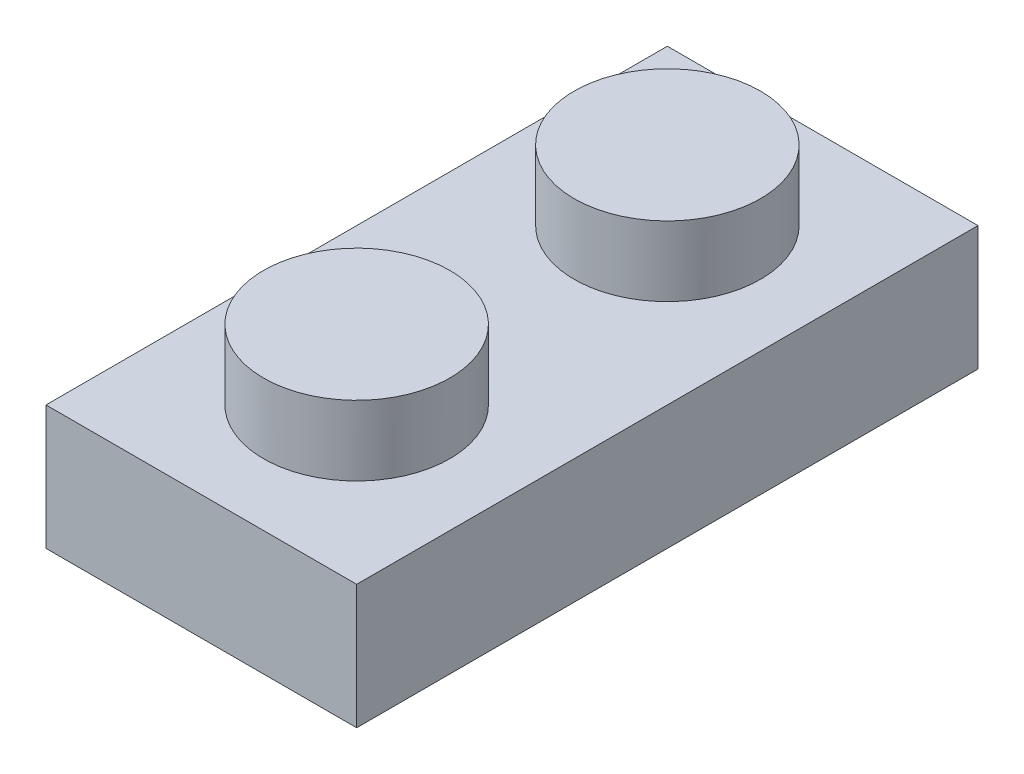
ISO-10303-21;
HEADER;
FILE_DESCRIPTION(('STEP AP214'),'2;1');
FILE_NAME('part.step','',(''),(''),'','','');
FILE_SCHEMA(('AUTOMOTIVE_DESIGN { 1 0 10303 214 1 1 1 1 }'));
ENDSEC;
DATA;
#1=APPLICATION_CONTEXT('core data for automotive mechanical design processes');
#2=APPLICATION_PROTOCOL_DEFINITION('international standard','automotive_design',2000,#1);
#3=PRODUCT_CONTEXT('',#1,'mechanical');
#4=PRODUCT('Part','Part','',(#3));
#5=PRODUCT_RELATED_PRODUCT_CATEGORY('part','',(#4));
#6=PRODUCT_DEFINITION_FORMATION('','',#4);
#7=PRODUCT_DEFINITION_CONTEXT('part definition',#1,'design');
#8=PRODUCT_DEFINITION('design','',#6,#7);
#9=PRODUCT_DEFINITION_SHAPE('','',#8);
#10=(LENGTH_UNIT() NAMED_UNIT(*) SI_UNIT(.MILLI.,.METRE.));
#11=(NAMED_UNIT(*) PLANE_ANGLE_UNIT() SI_UNIT($,.RADIAN.));
#12=(NAMED_UNIT(*) SI_UNIT($,.STERADIAN.) SOLID_ANGLE_UNIT());
#13=UNCERTAINTY_MEASURE_WITH_UNIT(LENGTH_MEASURE(1.E-05),#10,'distance_accuracy_value','');
#14=(GEOMETRIC_REPRESENTATION_CONTEXT(3) GLOBAL_UNCERTAINTY_ASSIGNED_CONTEXT((#13)) GLOBAL_UNIT_ASSIGNED_CONTEXT((#10,
#11,#12)) REPRESENTATION_CONTEXT('',''));
#15=CARTESIAN_POINT('',(0.,0.,0.));
#16=DIRECTION('',(0.,0.,1.));
#17=DIRECTION('',(1.,0.,0.));
#18=AXIS2_PLACEMENT_3D('',#15,#16,#17);
#19=CARTESIAN_POINT('',(0.,0.,16.));
#20=DIRECTION('',(1.,0.,0.));
#21=DIRECTION('',(0.,1.,0.));
#22=AXIS2_PLACEMENT_3D('',#19,#20,#21);
#23=PLANE('',#22);
#24=DIRECTION('',(0.,-1.,0.));
#25=VECTOR('',#24,1.);
#26=CARTESIAN_POINT('',(0.,0.,0.));
#27=LINE('',#26,#25);
#28=CARTESIAN_POINT('',(0.,3.2,0.));
#29=VERTEX_POINT('',#28);
#30=CARTESIAN_POINT('',(0.,0.,0.));
#31=VERTEX_POINT('',#30);
#32=EDGE_CURVE('E165',#29,#31,#27,.T.);
#33=ORIENTED_EDGE('',*,*,#32,.T.);
#34=DIRECTION('',(0.,0.,-1.));
#35=VECTOR('',#34,1.);
#36=CARTESIAN_POINT('',(0.,0.,16.));
#37=LINE('',#36,#35);
#38=CARTESIAN_POINT('',(0.,0.,16.));
#39=VERTEX_POINT('',#38);
#40=EDGE_CURVE('E202',#39,#31,#37,.T.);
#41=ORIENTED_EDGE('',*,*,#40,.F.);
#42=DIRECTION('',(0.,-1.,0.));
#43=VECTOR('',#42,1.);
#44=CARTESIAN_POINT('',(0.,0.,16.));
#45=LINE('',#44,#43);
#46=CARTESIAN_POINT('',(0.,3.2,16.));
#47=VERTEX_POINT('',#46);
#48=EDGE_CURVE('E171',#47,#39,#45,.T.);
#49=ORIENTED_EDGE('',*,*,#48,.F.);
#50=DIRECTION('',(0.,0.,-1.));
#51=VECTOR('',#50,1.);
#52=CARTESIAN_POINT('',(0.,3.2,16.));
#53=LINE('',#52,#51);
#54=EDGE_CURVE('E181',#47,#29,#53,.T.);
#55=ORIENTED_EDGE('',*,*,#54,.T.);
#56=EDGE_LOOP('',(#33,#41,#49,#55));
#57=FACE_BOUND('',#56,.T.);
#58=ADVANCED_FACE('F42',(#57),#23,.F.);
#59=CARTESIAN_POINT('',(0.,0.,16.));
#60=DIRECTION('',(0.,1.,0.));
#61=DIRECTION('',(0.,0.,1.));
#62=AXIS2_PLACEMENT_3D('',#59,#60,#61);
#63=PLANE('',#62);
#64=DIRECTION('',(1.,0.,0.));
#65=VECTOR('',#64,1.);
#66=CARTESIAN_POINT('',(1.6,0.,1.6));
#67=LINE('',#66,#65);
#68=CARTESIAN_POINT('',(1.6,0.,1.6));
#69=VERTEX_POINT('',#68);
#70=CARTESIAN_POINT('',(6.4,0.,1.6));
#71=VERTEX_POINT('',#70);
#72=EDGE_CURVE('E156',#69,#71,#67,.T.);
#73=ORIENTED_EDGE('',*,*,#72,.F.);
#74=DIRECTION('',(0.,0.,-1.));
#75=VECTOR('',#74,1.);
#76=CARTESIAN_POINT('',(1.6,0.,14.4));
#77=LINE('',#76,#75);
#78=CARTESIAN_POINT('',(1.6,0.,14.4));
#79=VERTEX_POINT('',#78);
#80=EDGE_CURVE('E57',#79,#69,#77,.T.);
#81=ORIENTED_EDGE('',*,*,#80,.F.);
#82=DIRECTION('',(-1.,0.,0.));
#83=VECTOR('',#82,1.);
#84=CARTESIAN_POINT('',(1.6,0.,14.4));
#85=LINE('',#84,#83);
#86=CARTESIAN_POINT('',(6.4,0.,14.4));
#87=VERTEX_POINT('',#86);
#88=EDGE_CURVE('E140',#87,#79,#85,.T.);
#89=ORIENTED_EDGE('',*,*,#88,.F.);
#90=DIRECTION('',(0.,0.,1.));
#91=VECTOR('',#90,1.);
#92=CARTESIAN_POINT('',(6.4,0.,14.4));
#93=LINE('',#92,#91);
#94=EDGE_CURVE('E144',#71,#87,#93,.T.);
#95=ORIENTED_EDGE('',*,*,#94,.F.);
#96=EDGE_LOOP('',(#73,#81,#89,#95));
#97=FACE_BOUND('',#96,.T.);
#98=DIRECTION('',(1.,0.,0.));
#99=VECTOR('',#98,1.);
#100=CARTESIAN_POINT('',(0.,0.,0.));
#101=LINE('',#100,#99);
#102=CARTESIAN_POINT('',(8.,0.,0.));
#103=VERTEX_POINT('',#102);
#104=EDGE_CURVE('E185',#31,#103,#101,.T.);
#105=ORIENTED_EDGE('',*,*,#104,.T.);
#106=DIRECTION('',(0.,0.,-1.));
#107=VECTOR('',#106,1.);
#108=CARTESIAN_POINT('',(8.,0.,16.));
#109=LINE('',#108,#107);
#110=CARTESIAN_POINT('',(8.,0.,16.));
#111=VERTEX_POINT('',#110);
#112=EDGE_CURVE('E198',#111,#103,#109,.T.);
#113=ORIENTED_EDGE('',*,*,#112,.F.);
#114=DIRECTION('',(1.,0.,0.));
#115=VECTOR('',#114,1.);
#116=CARTESIAN_POINT('',(0.,0.,16.));
#117=LINE('',#116,#115);
#118=EDGE_CURVE('E95',#39,#111,#117,.T.);
#119=ORIENTED_EDGE('',*,*,#118,.F.);
#120=ORIENTED_EDGE('',*,*,#40,.T.);
#121=EDGE_LOOP('',(#105,#113,#119,#120));
#122=FACE_BOUND('',#121,.T.);
#123=ADVANCED_FACE('F222',(#97,#122),#63,.F.);
#124=CARTESIAN_POINT('',(8.,0.,16.));
#125=DIRECTION('',(-1.,0.,0.));
#126=DIRECTION('',(0.,-1.,0.));
#127=AXIS2_PLACEMENT_3D('',#124,#125,#126);
#128=PLANE('',#127);
#129=DIRECTION('',(0.,1.,0.));
#130=VECTOR('',#129,1.);
#131=CARTESIAN_POINT('',(8.,0.,0.));
#132=LINE('',#131,#130);
#133=CARTESIAN_POINT('',(8.,3.2,0.));
#134=VERTEX_POINT('',#133);
#135=EDGE_CURVE('E188',#103,#134,#132,.T.);
#136=ORIENTED_EDGE('',*,*,#135,.T.);
#137=DIRECTION('',(0.,0.,-1.));
#138=VECTOR('',#137,1.);
#139=CARTESIAN_POINT('',(8.,3.2,16.));
#140=LINE('',#139,#138);
#141=CARTESIAN_POINT('',(8.,3.2,16.));
#142=VERTEX_POINT('',#141);
#143=EDGE_CURVE('E195',#142,#134,#140,.T.);
#144=ORIENTED_EDGE('',*,*,#143,.F.);
#145=DIRECTION('',(0.,1.,0.));
#146=VECTOR('',#145,1.);
#147=CARTESIAN_POINT('',(8.,0.,16.));
#148=LINE('',#147,#146);
#149=EDGE_CURVE('E176',#111,#142,#148,.T.);
#150=ORIENTED_EDGE('',*,*,#149,.F.);
#151=ORIENTED_EDGE('',*,*,#112,.T.);
#152=EDGE_LOOP('',(#136,#144,#150,#151));
#153=FACE_BOUND('',#152,.T.);
#154=ADVANCED_FACE('F213',(#153),#128,.F.);
#155=CARTESIAN_POINT('',(0.,3.2,16.));
#156=DIRECTION('',(0.,-1.,0.));
#157=DIRECTION('',(0.,0.,-1.));
#158=AXIS2_PLACEMENT_3D('',#155,#156,#157);
#159=PLANE('',#158);
#160=CARTESIAN_POINT('',(4.,3.2,12.));
#161=DIRECTION('',(0.,-1.,0.));
#162=DIRECTION('',(0.,0.,-1.));
#163=AXIS2_PLACEMENT_3D('',#160,#161,#162);
#164=CIRCLE('',#163,2.4);
#165=CARTESIAN_POINT('',(4.,3.2,9.6));
#166=VERTEX_POINT('',#165);
#167=EDGE_CURVE('E11',#166,#166,#164,.F.);
#168=ORIENTED_EDGE('',*,*,#167,.F.);
#169=EDGE_LOOP('',(#168));
#170=FACE_BOUND('',#169,.T.);
#171=CARTESIAN_POINT('',(4.,3.2,4.));
#172=DIRECTION('',(0.,-1.,0.));
#173=DIRECTION('',(0.,0.,-1.));
#174=AXIS2_PLACEMENT_3D('',#171,#172,#173);
#175=CIRCLE('',#174,2.4);
#176=CARTESIAN_POINT('',(4.,3.2,1.6));
#177=VERTEX_POINT('',#176);
#178=EDGE_CURVE('E50',#177,#177,#175,.F.);
#179=ORIENTED_EDGE('',*,*,#178,.F.);
#180=EDGE_LOOP('',(#179));
#181=FACE_BOUND('',#180,.T.);
#182=DIRECTION('',(-1.,0.,0.));
#183=VECTOR('',#182,1.);
#184=CARTESIAN_POINT('',(0.,3.2,0.));
#185=LINE('',#184,#183);
#186=EDGE_CURVE('E87',#134,#29,#185,.T.);
#187=ORIENTED_EDGE('',*,*,#186,.T.);
#188=ORIENTED_EDGE('',*,*,#54,.F.);
#189=DIRECTION('',(-1.,0.,0.));
#190=VECTOR('',#189,1.);
#191=CARTESIAN_POINT('',(0.,3.2,16.));
#192=LINE('',#191,#190);
#193=EDGE_CURVE('E66',#142,#47,#192,.T.);
#194=ORIENTED_EDGE('',*,*,#193,.F.);
#195=ORIENTED_EDGE('',*,*,#143,.T.);
#196=EDGE_LOOP('',(#187,#188,#194,#195));
#197=FACE_BOUND('',#196,.T.);
#198=ADVANCED_FACE('F210',(#170,#181,#197),#159,.F.);
#199=CARTESIAN_POINT('',(0.,0.,16.));
#200=DIRECTION('',(0.,0.,-1.));
#201=DIRECTION('',(-1.,0.,0.));
#202=AXIS2_PLACEMENT_3D('',#199,#200,#201);
#203=PLANE('',#202);
#204=ORIENTED_EDGE('',*,*,#48,.T.);
#205=ORIENTED_EDGE('',*,*,#118,.T.);
#206=ORIENTED_EDGE('',*,*,#149,.T.);
#207=ORIENTED_EDGE('',*,*,#193,.T.);
#208=EDGE_LOOP('',(#204,#205,#206,#207));
#209=FACE_BOUND('',#208,.T.);
#210=ADVANCED_FACE('F212',(#209),#203,.F.);
#211=CARTESIAN_POINT('',(0.,0.,0.));
#212=DIRECTION('',(0.,0.,-1.));
#213=DIRECTION('',(-1.,0.,0.));
#214=AXIS2_PLACEMENT_3D('',#211,#212,#213);
#215=PLANE('',#214);
#216=ORIENTED_EDGE('',*,*,#32,.F.);
#217=ORIENTED_EDGE('',*,*,#186,.F.);
#218=ORIENTED_EDGE('',*,*,#135,.F.);
#219=ORIENTED_EDGE('',*,*,#104,.F.);
#220=EDGE_LOOP('',(#216,#217,#218,#219));
#221=FACE_BOUND('',#220,.T.);
#222=ADVANCED_FACE('F220',(#221),#215,.T.);
#223=CARTESIAN_POINT('',(1.6,1.8,14.4));
#224=DIRECTION('',(-1.,0.,0.));
#225=DIRECTION('',(0.,0.,1.));
#226=AXIS2_PLACEMENT_3D('',#223,#224,#225);
#227=PLANE('',#226);
#228=ORIENTED_EDGE('',*,*,#80,.T.);
#229=DIRECTION('',(0.,-1.,0.));
#230=VECTOR('',#229,1.);
#231=CARTESIAN_POINT('',(1.6,1.8,1.6));
#232=LINE('',#231,#230);
#233=CARTESIAN_POINT('',(1.6,1.8,1.6));
#234=VERTEX_POINT('',#233);
#235=EDGE_CURVE('E115',#234,#69,#232,.T.);
#236=ORIENTED_EDGE('',*,*,#235,.F.);
#237=DIRECTION('',(0.,0.,-1.));
#238=VECTOR('',#237,1.);
#239=CARTESIAN_POINT('',(1.6,1.8,14.4));
#240=LINE('',#239,#238);
#241=CARTESIAN_POINT('',(1.6,1.8,14.4));
#242=VERTEX_POINT('',#241);
#243=EDGE_CURVE('E119',#242,#234,#240,.T.);
#244=ORIENTED_EDGE('',*,*,#243,.F.);
#245=DIRECTION('',(0.,-1.,0.));
#246=VECTOR('',#245,1.);
#247=CARTESIAN_POINT('',(1.6,1.8,14.4));
#248=LINE('',#247,#246);
#249=EDGE_CURVE('E162',#242,#79,#248,.T.);
#250=ORIENTED_EDGE('',*,*,#249,.T.);
#251=EDGE_LOOP('',(#228,#236,#244,#250));
#252=FACE_BOUND('',#251,.T.);
#253=ADVANCED_FACE('F117',(#252),#227,.F.);
#254=CARTESIAN_POINT('',(1.6,1.8,14.4));
#255=DIRECTION('',(0.,0.,1.));
#256=DIRECTION('',(1.,0.,0.));
#257=AXIS2_PLACEMENT_3D('',#254,#255,#256);
#258=PLANE('',#257);
#259=ORIENTED_EDGE('',*,*,#88,.T.);
#260=ORIENTED_EDGE('',*,*,#249,.F.);
#261=DIRECTION('',(-1.,0.,0.));
#262=VECTOR('',#261,1.);
#263=CARTESIAN_POINT('',(1.6,1.8,14.4));
#264=LINE('',#263,#262);
#265=CARTESIAN_POINT('',(6.4,1.8,14.4));
#266=VERTEX_POINT('',#265);
#267=EDGE_CURVE('E126',#266,#242,#264,.T.);
#268=ORIENTED_EDGE('',*,*,#267,.F.);
#269=DIRECTION('',(0.,-1.,0.));
#270=VECTOR('',#269,1.);
#271=CARTESIAN_POINT('',(6.4,1.8,14.4));
#272=LINE('',#271,#270);
#273=EDGE_CURVE('E166',#266,#87,#272,.T.);
#274=ORIENTED_EDGE('',*,*,#273,.T.);
#275=EDGE_LOOP('',(#259,#260,#268,#274));
#276=FACE_BOUND('',#275,.T.);
#277=ADVANCED_FACE('F244',(#276),#258,.F.);
#278=CARTESIAN_POINT('',(6.4,1.8,14.4));
#279=DIRECTION('',(1.,0.,0.));
#280=DIRECTION('',(0.,0.,-1.));
#281=AXIS2_PLACEMENT_3D('',#278,#279,#280);
#282=PLANE('',#281);
#283=ORIENTED_EDGE('',*,*,#94,.T.);
#284=ORIENTED_EDGE('',*,*,#273,.F.);
#285=DIRECTION('',(0.,0.,1.));
#286=VECTOR('',#285,1.);
#287=CARTESIAN_POINT('',(6.4,1.8,14.4));
#288=LINE('',#287,#286);
#289=CARTESIAN_POINT('',(6.4,1.8,1.6));
#290=VERTEX_POINT('',#289);
#291=EDGE_CURVE('E135',#290,#266,#288,.T.);
#292=ORIENTED_EDGE('',*,*,#291,.F.);
#293=DIRECTION('',(0.,-1.,0.));
#294=VECTOR('',#293,1.);
#295=CARTESIAN_POINT('',(6.4,1.8,1.6));
#296=LINE('',#295,#294);
#297=EDGE_CURVE('E125',#290,#71,#296,.T.);
#298=ORIENTED_EDGE('',*,*,#297,.T.);
#299=EDGE_LOOP('',(#283,#284,#292,#298));
#300=FACE_BOUND('',#299,.T.);
#301=ADVANCED_FACE('F249',(#300),#282,.F.);
#302=CARTESIAN_POINT('',(1.6,1.8,1.6));
#303=DIRECTION('',(0.,0.,-1.));
#304=DIRECTION('',(-1.,0.,0.));
#305=AXIS2_PLACEMENT_3D('',#302,#303,#304);
#306=PLANE('',#305);
#307=ORIENTED_EDGE('',*,*,#72,.T.);
#308=ORIENTED_EDGE('',*,*,#297,.F.);
#309=DIRECTION('',(1.,0.,0.));
#310=VECTOR('',#309,1.);
#311=CARTESIAN_POINT('',(1.6,1.8,1.6));
#312=LINE('',#311,#310);
#313=EDGE_CURVE('E129',#234,#290,#312,.T.);
#314=ORIENTED_EDGE('',*,*,#313,.F.);
#315=ORIENTED_EDGE('',*,*,#235,.T.);
#316=EDGE_LOOP('',(#307,#308,#314,#315));
#317=FACE_BOUND('',#316,.T.);
#318=ADVANCED_FACE('F130',(#317),#306,.F.);
#319=CARTESIAN_POINT('',(0.,1.8,0.));
#320=DIRECTION('',(0.,-1.,0.));
#321=DIRECTION('',(0.,0.,-1.));
#322=AXIS2_PLACEMENT_3D('',#319,#320,#321);
#323=PLANE('',#322);
#324=CARTESIAN_POINT('',(4.,1.8,8.));
#325=DIRECTION('',(0.,-1.,0.));
#326=DIRECTION('',(0.,0.,-1.));
#327=AXIS2_PLACEMENT_3D('',#324,#325,#326);
#328=CIRCLE('',#327,1.6);
#329=CARTESIAN_POINT('',(4.,1.8,6.4));
#330=VERTEX_POINT('',#329);
#331=EDGE_CURVE('E295',#330,#330,#328,.T.);
#332=ORIENTED_EDGE('',*,*,#331,.F.);
#333=EDGE_LOOP('',(#332));
#334=FACE_BOUND('',#333,.T.);
#335=ORIENTED_EDGE('',*,*,#243,.T.);
#336=ORIENTED_EDGE('',*,*,#313,.T.);
#337=ORIENTED_EDGE('',*,*,#291,.T.);
#338=ORIENTED_EDGE('',*,*,#267,.T.);
#339=EDGE_LOOP('',(#335,#336,#337,#338));
#340=FACE_BOUND('',#339,.T.);
#341=ADVANCED_FACE('F137',(#334,#340),#323,.T.);
#342=CARTESIAN_POINT('',(4.,5.,4.));
#343=DIRECTION('',(0.,-1.,0.));
#344=DIRECTION('',(0.,0.,-1.));
#345=AXIS2_PLACEMENT_3D('',#342,#343,#344);
#346=CYLINDRICAL_SURFACE('',#345,2.4);
#347=CARTESIAN_POINT('',(4.,5.,4.));
#348=DIRECTION('',(0.,1.,0.));
#349=DIRECTION('',(0.,0.,1.));
#350=AXIS2_PLACEMENT_3D('',#347,#348,#349);
#351=CIRCLE('',#350,2.4);
#352=CARTESIAN_POINT('',(4.,5.,6.4));
#353=VERTEX_POINT('',#352);
#354=EDGE_CURVE('E147',#353,#353,#351,.T.);
#355=ORIENTED_EDGE('',*,*,#354,.F.);
#356=EDGE_LOOP('',(#355));
#357=FACE_BOUND('',#356,.T.);
#358=ORIENTED_EDGE('',*,*,#178,.T.);
#359=EDGE_LOOP('',(#358));
#360=FACE_BOUND('',#359,.T.);
#361=ADVANCED_FACE('F208',(#357,#360),#346,.T.);
#362=CARTESIAN_POINT('',(4.,5.,4.));
#363=DIRECTION('',(0.,1.,0.));
#364=DIRECTION('',(0.,0.,1.));
#365=AXIS2_PLACEMENT_3D('',#362,#363,#364);
#366=PLANE('',#365);
#367=ORIENTED_EDGE('',*,*,#354,.T.);
#368=EDGE_LOOP('',(#367));
#369=FACE_BOUND('',#368,.T.);
#370=ADVANCED_FACE('F261',(#369),#366,.T.);
#371=CARTESIAN_POINT('',(4.,5.,12.));
#372=DIRECTION('',(0.,-1.,0.));
#373=DIRECTION('',(0.,0.,-1.));
#374=AXIS2_PLACEMENT_3D('',#371,#372,#373);
#375=CYLINDRICAL_SURFACE('',#374,2.4);
#376=CARTESIAN_POINT('',(4.,5.,12.));
#377=DIRECTION('',(0.,1.,0.));
#378=DIRECTION('',(0.,0.,1.));
#379=AXIS2_PLACEMENT_3D('',#376,#377,#378);
#380=CIRCLE('',#379,2.4);
#381=CARTESIAN_POINT('',(4.,5.,14.4));
#382=VERTEX_POINT('',#381);
#383=EDGE_CURVE('E308',#382,#382,#380,.T.);
#384=ORIENTED_EDGE('',*,*,#383,.F.);
#385=EDGE_LOOP('',(#384));
#386=FACE_BOUND('',#385,.T.);
#387=ORIENTED_EDGE('',*,*,#167,.T.);
#388=EDGE_LOOP('',(#387));
#389=FACE_BOUND('',#388,.T.);
#390=ADVANCED_FACE('F265',(#386,#389),#375,.T.);
#391=CARTESIAN_POINT('',(4.,5.,12.));
#392=DIRECTION('',(0.,1.,0.));
#393=DIRECTION('',(0.,0.,1.));
#394=AXIS2_PLACEMENT_3D('',#391,#392,#393);
#395=PLANE('',#394);
#396=ORIENTED_EDGE('',*,*,#383,.T.);
#397=EDGE_LOOP('',(#396));
#398=FACE_BOUND('',#397,.T.);
#399=ADVANCED_FACE('F267',(#398),#395,.T.);
#400=CARTESIAN_POINT('',(4.,0.,8.));
#401=DIRECTION('',(0.,1.,0.));
#402=DIRECTION('',(0.,0.,1.));
#403=AXIS2_PLACEMENT_3D('',#400,#401,#402);
#404=CYLINDRICAL_SURFACE('',#403,1.6);
#405=CARTESIAN_POINT('',(4.,0.,8.));
#406=DIRECTION('',(0.,-1.,0.));
#407=DIRECTION('',(0.,0.,-1.));
#408=AXIS2_PLACEMENT_3D('',#405,#406,#407);
#409=CIRCLE('',#408,1.6);
#410=CARTESIAN_POINT('',(4.,0.,6.4));
#411=VERTEX_POINT('',#410);
#412=EDGE_CURVE('E301',#411,#411,#409,.T.);
#413=ORIENTED_EDGE('',*,*,#412,.F.);
#414=EDGE_LOOP('',(#413));
#415=FACE_BOUND('',#414,.T.);
#416=ORIENTED_EDGE('',*,*,#331,.T.);
#417=EDGE_LOOP('',(#416));
#418=FACE_BOUND('',#417,.T.);
#419=ADVANCED_FACE('F270',(#415,#418),#404,.T.);
#420=CARTESIAN_POINT('',(4.,0.,8.));
#421=DIRECTION('',(0.,-1.,0.));
#422=DIRECTION('',(0.,0.,-1.));
#423=AXIS2_PLACEMENT_3D('',#420,#421,#422);
#424=PLANE('',#423);
#425=CARTESIAN_POINT('',(4.,0.,8.));
#426=DIRECTION('',(0.,-1.,0.));
#427=DIRECTION('',(0.,0.,-1.));
#428=AXIS2_PLACEMENT_3D('',#425,#426,#427);
#429=CIRCLE('',#428,0.800000000000001);
#430=CARTESIAN_POINT('',(4.,0.,7.2));
#431=VERTEX_POINT('',#430);
#432=EDGE_CURVE('E296',#431,#431,#429,.T.);
#433=ORIENTED_EDGE('',*,*,#432,.F.);
#434=EDGE_LOOP('',(#433));
#435=FACE_BOUND('',#434,.T.);
#436=ORIENTED_EDGE('',*,*,#412,.T.);
#437=EDGE_LOOP('',(#436));
#438=FACE_BOUND('',#437,.T.);
#439=ADVANCED_FACE('F277',(#435,#438),#424,.T.);
#440=CARTESIAN_POINT('',(4.,1.8,8.));
#441=DIRECTION('',(0.,-1.,0.));
#442=DIRECTION('',(0.,0.,-1.));
#443=AXIS2_PLACEMENT_3D('',#440,#441,#442);
#444=CYLINDRICAL_SURFACE('',#443,0.800000000000001);
#445=CARTESIAN_POINT('',(4.,1.8,8.));
#446=DIRECTION('',(0.,-1.,0.));
#447=DIRECTION('',(0.,0.,-1.));
#448=AXIS2_PLACEMENT_3D('',#445,#446,#447);
#449=CIRCLE('',#448,0.800000000000001);
#450=CARTESIAN_POINT('',(4.,1.8,7.2));
#451=VERTEX_POINT('',#450);
#452=EDGE_CURVE('E293',#451,#451,#449,.T.);
#453=ORIENTED_EDGE('',*,*,#452,.F.);
#454=EDGE_LOOP('',(#453));
#455=FACE_BOUND('',#454,.T.);
#456=ORIENTED_EDGE('',*,*,#432,.T.);
#457=EDGE_LOOP('',(#456));
#458=FACE_BOUND('',#457,.T.);
#459=ADVANCED_FACE('F281',(#455,#458),#444,.F.);
#460=CARTESIAN_POINT('',(4.,1.8,8.));
#461=DIRECTION('',(0.,-1.,0.));
#462=DIRECTION('',(0.,0.,-1.));
#463=AXIS2_PLACEMENT_3D('',#460,#461,#462);
#464=PLANE('',#463);
#465=ORIENTED_EDGE('',*,*,#452,.T.);
#466=EDGE_LOOP('',(#465));
#467=FACE_BOUND('',#466,.T.);
#468=ADVANCED_FACE('F285',(#467),#464,.T.);
#469=CLOSED_SHELL('',(#58,#123,#154,#198,#210,#222,#253,#277,#301,#318,#341,#361,#370,#390,#399,
#419,#439,#459,#468));
#470=MANIFOLD_SOLID_BREP('B2',#469);
#471=ADVANCED_BREP_SHAPE_REPRESENTATION('',(#18,#470),#14);
#472=SHAPE_DEFINITION_REPRESENTATION(#9,#471);
ENDSEC;
END-ISO-10303-21;
